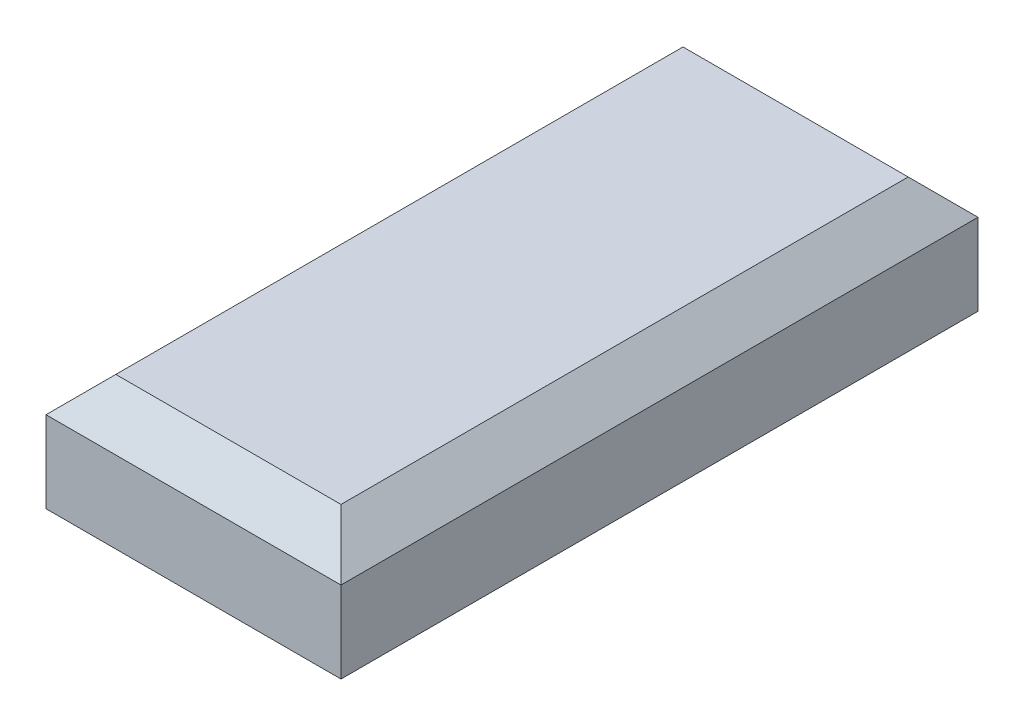
ISO-10303-21;
HEADER;
FILE_DESCRIPTION(('STEP AP214'),'2;1');
FILE_NAME('part.step','',(''),(''),'','','');
FILE_SCHEMA(('AUTOMOTIVE_DESIGN { 1 0 10303 214 1 1 1 1 }'));
ENDSEC;
DATA;
#1=APPLICATION_CONTEXT('core data for automotive mechanical design processes');
#2=APPLICATION_PROTOCOL_DEFINITION('international standard','automotive_design',2000,#1);
#3=PRODUCT_CONTEXT('',#1,'mechanical');
#4=PRODUCT('Part','Part','',(#3));
#5=PRODUCT_RELATED_PRODUCT_CATEGORY('part','',(#4));
#6=PRODUCT_DEFINITION_FORMATION('','',#4);
#7=PRODUCT_DEFINITION_CONTEXT('part definition',#1,'design');
#8=PRODUCT_DEFINITION('design','',#6,#7);
#9=PRODUCT_DEFINITION_SHAPE('','',#8);
#10=(LENGTH_UNIT() NAMED_UNIT(*) SI_UNIT(.MILLI.,.METRE.));
#11=(NAMED_UNIT(*) PLANE_ANGLE_UNIT() SI_UNIT($,.RADIAN.));
#12=(NAMED_UNIT(*) SI_UNIT($,.STERADIAN.) SOLID_ANGLE_UNIT());
#13=UNCERTAINTY_MEASURE_WITH_UNIT(LENGTH_MEASURE(1.E-05),#10,'distance_accuracy_value','');
#14=(GEOMETRIC_REPRESENTATION_CONTEXT(3) GLOBAL_UNCERTAINTY_ASSIGNED_CONTEXT((#13)) GLOBAL_UNIT_ASSIGNED_CONTEXT((#10,
#11,#12)) REPRESENTATION_CONTEXT('',''));
#15=CARTESIAN_POINT('',(0.,0.,0.));
#16=DIRECTION('',(0.,0.,1.));
#17=DIRECTION('',(1.,0.,0.));
#18=AXIS2_PLACEMENT_3D('',#15,#16,#17);
#19=CARTESIAN_POINT('',(0.,12.9969134233995,29.));
#20=DIRECTION('',(0.,1.,0.));
#21=DIRECTION('',(0.,0.,1.));
#22=AXIS2_PLACEMENT_3D('',#19,#20,#21);
#23=PLANE('',#22);
#24=DIRECTION('',(0.,0.,1.));
#25=VECTOR('',#24,1.);
#26=CARTESIAN_POINT('',(13.7393398282202,12.9969134233995,0.));
#27=LINE('',#26,#25);
#28=CARTESIAN_POINT('',(13.7393398282202,12.9969134233995,0.561666829975703));
#29=VERTEX_POINT('',#28);
#30=CARTESIAN_POINT('',(13.7393398282202,12.9969134233995,27.9393398282202));
#31=VERTEX_POINT('',#30);
#32=EDGE_CURVE('E11',#29,#31,#27,.T.);
#33=ORIENTED_EDGE('',*,*,#32,.T.);
#34=DIRECTION('',(1.,0.,0.));
#35=VECTOR('',#34,1.);
#36=CARTESIAN_POINT('',(0.,12.9969134233995,27.9393398282202));
#37=LINE('',#36,#35);
#38=CARTESIAN_POINT('',(1.06066017177982,12.9969134233995,27.9393398282202));
#39=VERTEX_POINT('',#38);
#40=EDGE_CURVE('E58',#39,#31,#37,.T.);
#41=ORIENTED_EDGE('',*,*,#40,.F.);
#42=DIRECTION('',(0.,0.,1.));
#43=VECTOR('',#42,1.);
#44=CARTESIAN_POINT('',(1.06066017177982,12.9969134233995,0.));
#45=LINE('',#44,#43);
#46=CARTESIAN_POINT('',(1.06066017177982,12.9969134233995,0.561666829975703));
#47=VERTEX_POINT('',#46);
#48=EDGE_CURVE('E90',#47,#39,#45,.T.);
#49=ORIENTED_EDGE('',*,*,#48,.F.);
#50=DIRECTION('',(1.,0.,0.));
#51=VECTOR('',#50,1.);
#52=CARTESIAN_POINT('',(0.,12.9969134233995,0.561666829975703));
#53=LINE('',#52,#51);
#54=EDGE_CURVE('E43',#47,#29,#53,.T.);
#55=ORIENTED_EDGE('',*,*,#54,.T.);
#56=EDGE_LOOP('',(#33,#41,#49,#55));
#57=FACE_BOUND('',#56,.T.);
#58=ADVANCED_FACE('F35',(#57),#23,.F.);
#59=CARTESIAN_POINT('',(0.,17.9969134233995,0.));
#60=DIRECTION('',(0.,1.,0.));
#61=DIRECTION('',(0.,0.,1.));
#62=AXIS2_PLACEMENT_3D('',#59,#60,#61);
#63=PLANE('',#62);
#64=DIRECTION('',(0.,0.,1.));
#65=VECTOR('',#64,1.);
#66=CARTESIAN_POINT('',(2.56066017177982,17.9969134233995,27.9393398282202));
#67=LINE('',#66,#65);
#68=CARTESIAN_POINT('',(2.56066017177982,17.9969134233995,2.06166682997571));
#69=VERTEX_POINT('',#68);
#70=CARTESIAN_POINT('',(2.56066017177982,17.9969134233995,26.4393398282202));
#71=VERTEX_POINT('',#70);
#72=EDGE_CURVE('E114',#69,#71,#67,.T.);
#73=ORIENTED_EDGE('',*,*,#72,.T.);
#74=DIRECTION('',(1.,0.,0.));
#75=VECTOR('',#74,1.);
#76=CARTESIAN_POINT('',(13.7393398282202,17.9969134233995,26.4393398282202));
#77=LINE('',#76,#75);
#78=CARTESIAN_POINT('',(12.2393398282202,17.9969134233995,26.4393398282202));
#79=VERTEX_POINT('',#78);
#80=EDGE_CURVE('E116',#71,#79,#77,.T.);
#81=ORIENTED_EDGE('',*,*,#80,.T.);
#82=DIRECTION('',(0.,0.,-1.));
#83=VECTOR('',#82,1.);
#84=CARTESIAN_POINT('',(12.2393398282202,17.9969134233995,0.));
#85=LINE('',#84,#83);
#86=CARTESIAN_POINT('',(12.2393398282202,17.9969134233995,2.06166682997571));
#87=VERTEX_POINT('',#86);
#88=EDGE_CURVE('E110',#79,#87,#85,.T.);
#89=ORIENTED_EDGE('',*,*,#88,.T.);
#90=DIRECTION('',(-1.,0.,0.));
#91=VECTOR('',#90,1.);
#92=CARTESIAN_POINT('',(0.,17.9969134233995,2.06166682997571));
#93=LINE('',#92,#91);
#94=EDGE_CURVE('E112',#87,#69,#93,.T.);
#95=ORIENTED_EDGE('',*,*,#94,.T.);
#96=EDGE_LOOP('',(#73,#81,#89,#95));
#97=FACE_BOUND('',#96,.T.);
#98=ADVANCED_FACE('F156',(#97),#63,.T.);
#99=CARTESIAN_POINT('',(13.7393398282202,16.4969134233995,0.));
#100=DIRECTION('',(-0.707106781186546,-0.707106781186549,0.));
#101=DIRECTION('',(0.,0.,1.));
#102=AXIS2_PLACEMENT_3D('',#99,#100,#101);
#103=PLANE('',#102);
#104=DIRECTION('',(-0.577350269189627,0.577350269189624,0.577350269189627));
#105=VECTOR('',#104,1.);
#106=CARTESIAN_POINT('',(13.9265621048787,16.3096911467409,0.374444553317135));
#107=LINE('',#106,#105);
#108=CARTESIAN_POINT('',(13.7393398282202,16.4969134233995,0.561666829975703));
#109=VERTEX_POINT('',#108);
#110=EDGE_CURVE('E129',#109,#87,#107,.T.);
#111=ORIENTED_EDGE('',*,*,#110,.T.);
#112=ORIENTED_EDGE('',*,*,#88,.F.);
#113=DIRECTION('',(-0.577350269189627,0.577350269189624,-0.577350269189627));
#114=VECTOR('',#113,1.);
#115=CARTESIAN_POINT('',(4.42622655214675,25.8100266994729,18.6262265521468));
#116=LINE('',#115,#114);
#117=CARTESIAN_POINT('',(13.7393398282202,16.4969134233995,27.9393398282202));
#118=VERTEX_POINT('',#117);
#119=EDGE_CURVE('E126',#118,#79,#116,.T.);
#120=ORIENTED_EDGE('',*,*,#119,.F.);
#121=DIRECTION('',(0.,0.,1.));
#122=VECTOR('',#121,1.);
#123=CARTESIAN_POINT('',(13.7393398282202,16.4969134233995,0.));
#124=LINE('',#123,#122);
#125=EDGE_CURVE('E124',#109,#118,#124,.T.);
#126=ORIENTED_EDGE('',*,*,#125,.F.);
#127=EDGE_LOOP('',(#111,#112,#120,#126));
#128=FACE_BOUND('',#127,.T.);
#129=ADVANCED_FACE('F154',(#128),#103,.F.);
#130=CARTESIAN_POINT('',(0.,16.4969134233995,0.561666829975703));
#131=DIRECTION('',(0.,-0.707106781186549,0.707106781186546));
#132=DIRECTION('',(1.,0.,0.));
#133=AXIS2_PLACEMENT_3D('',#130,#131,#132);
#134=PLANE('',#133);
#135=ORIENTED_EDGE('',*,*,#110,.F.);
#136=DIRECTION('',(1.,0.,0.));
#137=VECTOR('',#136,1.);
#138=CARTESIAN_POINT('',(0.,16.4969134233995,0.561666829975703));
#139=LINE('',#138,#137);
#140=CARTESIAN_POINT('',(1.06066017177982,16.4969134233995,0.561666829975703));
#141=VERTEX_POINT('',#140);
#142=EDGE_CURVE('E122',#141,#109,#139,.T.);
#143=ORIENTED_EDGE('',*,*,#142,.F.);
#144=DIRECTION('',(-0.577350269189627,-0.577350269189624,-0.577350269189627));
#145=VECTOR('',#144,1.);
#146=CARTESIAN_POINT('',(0.707106781186546,16.1433600328062,0.208113439382429));
#147=LINE('',#146,#145);
#148=EDGE_CURVE('E38',#69,#141,#147,.T.);
#149=ORIENTED_EDGE('',*,*,#148,.F.);
#150=ORIENTED_EDGE('',*,*,#94,.F.);
#151=EDGE_LOOP('',(#135,#143,#149,#150));
#152=FACE_BOUND('',#151,.T.);
#153=ADVANCED_FACE('F145',(#152),#134,.F.);
#154=CARTESIAN_POINT('',(0.,17.9969134233995,0.561666829975703));
#155=DIRECTION('',(0.,0.,-1.));
#156=DIRECTION('',(-1.,0.,0.));
#157=AXIS2_PLACEMENT_3D('',#154,#155,#156);
#158=PLANE('',#157);
#159=DIRECTION('',(0.,-1.,0.));
#160=VECTOR('',#159,1.);
#161=CARTESIAN_POINT('',(1.06066017177982,17.9969134233995,0.561666829975703));
#162=LINE('',#161,#160);
#163=EDGE_CURVE('E93',#141,#47,#162,.T.);
#164=ORIENTED_EDGE('',*,*,#163,.F.);
#165=ORIENTED_EDGE('',*,*,#142,.T.);
#166=DIRECTION('',(0.,-1.,0.));
#167=VECTOR('',#166,1.);
#168=CARTESIAN_POINT('',(13.7393398282202,17.9969134233995,0.561666829975703));
#169=LINE('',#168,#167);
#170=EDGE_CURVE('E105',#109,#29,#169,.T.);
#171=ORIENTED_EDGE('',*,*,#170,.T.);
#172=ORIENTED_EDGE('',*,*,#54,.F.);
#173=EDGE_LOOP('',(#164,#165,#171,#172));
#174=FACE_BOUND('',#173,.T.);
#175=ADVANCED_FACE('F147',(#174),#158,.T.);
#176=CARTESIAN_POINT('',(2.56066017177982,17.9969134233995,0.));
#177=DIRECTION('',(-0.707106781186546,0.707106781186549,0.));
#178=DIRECTION('',(0.,0.,-1.));
#179=AXIS2_PLACEMENT_3D('',#176,#177,#178);
#180=PLANE('',#179);
#181=ORIENTED_EDGE('',*,*,#148,.T.);
#182=DIRECTION('',(0.,0.,-1.));
#183=VECTOR('',#182,1.);
#184=CARTESIAN_POINT('',(1.06066017177982,16.4969134233995,0.561666829975703));
#185=LINE('',#184,#183);
#186=CARTESIAN_POINT('',(1.06066017177982,16.4969134233995,27.9393398282202));
#187=VERTEX_POINT('',#186);
#188=EDGE_CURVE('E120',#187,#141,#185,.T.);
#189=ORIENTED_EDGE('',*,*,#188,.F.);
#190=DIRECTION('',(0.577350269189627,0.577350269189624,-0.577350269189627));
#191=VECTOR('',#190,1.);
#192=CARTESIAN_POINT('',(11.3737734478532,26.8100266994729,17.6262265521468));
#193=LINE('',#192,#191);
#194=EDGE_CURVE('E128',#71,#187,#193,.F.);
#195=ORIENTED_EDGE('',*,*,#194,.F.);
#196=ORIENTED_EDGE('',*,*,#72,.F.);
#197=EDGE_LOOP('',(#181,#189,#195,#196));
#198=FACE_BOUND('',#197,.T.);
#199=ADVANCED_FACE('F140',(#198),#180,.T.);
#200=CARTESIAN_POINT('',(1.06066017177982,17.9969134233995,0.));
#201=DIRECTION('',(1.,0.,0.));
#202=DIRECTION('',(0.,0.,-1.));
#203=AXIS2_PLACEMENT_3D('',#200,#201,#202);
#204=PLANE('',#203);
#205=DIRECTION('',(0.,-1.,0.));
#206=VECTOR('',#205,1.);
#207=CARTESIAN_POINT('',(1.06066017177982,17.9969134233995,27.9393398282202));
#208=LINE('',#207,#206);
#209=EDGE_CURVE('E92',#187,#39,#208,.T.);
#210=ORIENTED_EDGE('',*,*,#209,.F.);
#211=ORIENTED_EDGE('',*,*,#188,.T.);
#212=ORIENTED_EDGE('',*,*,#163,.T.);
#213=ORIENTED_EDGE('',*,*,#48,.T.);
#214=EDGE_LOOP('',(#210,#211,#212,#213));
#215=FACE_BOUND('',#214,.T.);
#216=ADVANCED_FACE('F91',(#215),#204,.F.);
#217=CARTESIAN_POINT('',(0.,17.9969134233995,26.4393398282202));
#218=DIRECTION('',(0.,0.707106781186549,0.707106781186546));
#219=DIRECTION('',(-1.,0.,0.));
#220=AXIS2_PLACEMENT_3D('',#217,#218,#219);
#221=PLANE('',#220);
#222=ORIENTED_EDGE('',*,*,#194,.T.);
#223=DIRECTION('',(-1.,0.,0.));
#224=VECTOR('',#223,1.);
#225=CARTESIAN_POINT('',(1.06066017177982,16.4969134233995,27.9393398282202));
#226=LINE('',#225,#224);
#227=EDGE_CURVE('E103',#118,#187,#226,.T.);
#228=ORIENTED_EDGE('',*,*,#227,.F.);
#229=ORIENTED_EDGE('',*,*,#119,.T.);
#230=ORIENTED_EDGE('',*,*,#80,.F.);
#231=EDGE_LOOP('',(#222,#228,#229,#230));
#232=FACE_BOUND('',#231,.T.);
#233=ADVANCED_FACE('F152',(#232),#221,.T.);
#234=CARTESIAN_POINT('',(13.7393398282202,17.9969134233995,0.));
#235=DIRECTION('',(1.,0.,0.));
#236=DIRECTION('',(0.,0.,-1.));
#237=AXIS2_PLACEMENT_3D('',#234,#235,#236);
#238=PLANE('',#237);
#239=ORIENTED_EDGE('',*,*,#170,.F.);
#240=ORIENTED_EDGE('',*,*,#125,.T.);
#241=DIRECTION('',(0.,-1.,0.));
#242=VECTOR('',#241,1.);
#243=CARTESIAN_POINT('',(13.7393398282202,17.9969134233995,27.9393398282202));
#244=LINE('',#243,#242);
#245=EDGE_CURVE('E98',#118,#31,#244,.T.);
#246=ORIENTED_EDGE('',*,*,#245,.T.);
#247=ORIENTED_EDGE('',*,*,#32,.F.);
#248=EDGE_LOOP('',(#239,#240,#246,#247));
#249=FACE_BOUND('',#248,.T.);
#250=ADVANCED_FACE('F149',(#249),#238,.T.);
#251=CARTESIAN_POINT('',(0.,17.9969134233995,27.9393398282202));
#252=DIRECTION('',(0.,0.,-1.));
#253=DIRECTION('',(-1.,0.,0.));
#254=AXIS2_PLACEMENT_3D('',#251,#252,#253);
#255=PLANE('',#254);
#256=ORIENTED_EDGE('',*,*,#245,.F.);
#257=ORIENTED_EDGE('',*,*,#227,.T.);
#258=ORIENTED_EDGE('',*,*,#209,.T.);
#259=ORIENTED_EDGE('',*,*,#40,.T.);
#260=EDGE_LOOP('',(#256,#257,#258,#259));
#261=FACE_BOUND('',#260,.T.);
#262=ADVANCED_FACE('F101',(#261),#255,.F.);
#263=CLOSED_SHELL('',(#58,#98,#129,#153,#175,#199,#216,#233,#250,#262));
#264=MANIFOLD_SOLID_BREP('B2',#263);
#265=ADVANCED_BREP_SHAPE_REPRESENTATION('',(#18,#264),#14);
#266=SHAPE_DEFINITION_REPRESENTATION(#9,#265);
ENDSEC;
END-ISO-10303-21;
